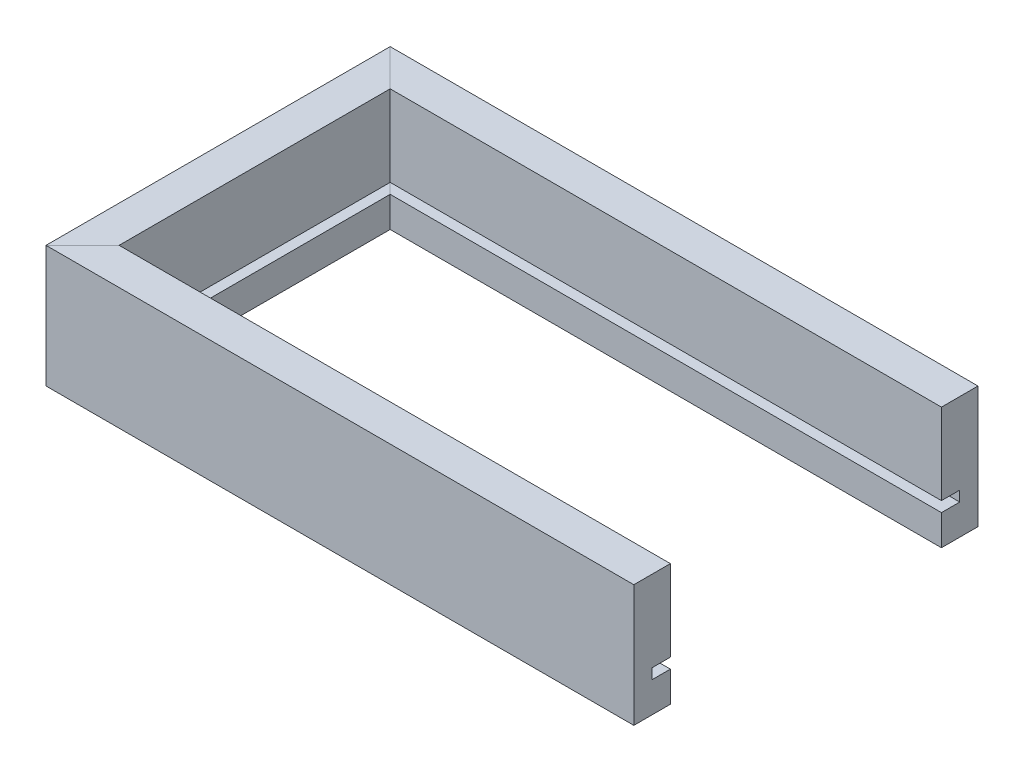
ISO-10303-21;
HEADER;
FILE_DESCRIPTION(('STEP AP214'),'2;1');
FILE_NAME('part.step','',(''),(''),'','','');
FILE_SCHEMA(('AUTOMOTIVE_DESIGN { 1 0 10303 214 1 1 1 1 }'));
ENDSEC;
DATA;
#1=APPLICATION_CONTEXT('core data for automotive mechanical design processes');
#2=APPLICATION_PROTOCOL_DEFINITION('international standard','automotive_design',2000,#1);
#3=PRODUCT_CONTEXT('',#1,'mechanical');
#4=PRODUCT('Part','Part','',(#3));
#5=PRODUCT_RELATED_PRODUCT_CATEGORY('part','',(#4));
#6=PRODUCT_DEFINITION_FORMATION('','',#4);
#7=PRODUCT_DEFINITION_CONTEXT('part definition',#1,'design');
#8=PRODUCT_DEFINITION('design','',#6,#7);
#9=PRODUCT_DEFINITION_SHAPE('','',#8);
#10=(LENGTH_UNIT() NAMED_UNIT(*) SI_UNIT(.MILLI.,.METRE.));
#11=(NAMED_UNIT(*) PLANE_ANGLE_UNIT() SI_UNIT($,.RADIAN.));
#12=(NAMED_UNIT(*) SI_UNIT($,.STERADIAN.) SOLID_ANGLE_UNIT());
#13=UNCERTAINTY_MEASURE_WITH_UNIT(LENGTH_MEASURE(1.E-05),#10,'distance_accuracy_value','');
#14=(GEOMETRIC_REPRESENTATION_CONTEXT(3) GLOBAL_UNCERTAINTY_ASSIGNED_CONTEXT((#13)) GLOBAL_UNIT_ASSIGNED_CONTEXT((#10,
#11,#12)) REPRESENTATION_CONTEXT('',''));
#15=CARTESIAN_POINT('',(0.,0.,0.));
#16=DIRECTION('',(0.,0.,1.));
#17=DIRECTION('',(1.,0.,0.));
#18=AXIS2_PLACEMENT_3D('',#15,#16,#17);
#19=CARTESIAN_POINT('',(46.75,0.,0.));
#20=DIRECTION('',(1.,0.,0.));
#21=DIRECTION('',(0.,0.,-1.));
#22=AXIS2_PLACEMENT_3D('',#19,#20,#21);
#23=PLANE('',#22);
#24=DIRECTION('',(0.,0.,-1.));
#25=VECTOR('',#24,1.);
#26=CARTESIAN_POINT('',(46.75,0.85,22.25));
#27=LINE('',#26,#25);
#28=CARTESIAN_POINT('',(46.75,0.85,25.25));
#29=VERTEX_POINT('',#28);
#30=CARTESIAN_POINT('',(46.75,0.85,22.25));
#31=VERTEX_POINT('',#30);
#32=EDGE_CURVE('E108',#29,#31,#27,.T.);
#33=ORIENTED_EDGE('',*,*,#32,.T.);
#34=DIRECTION('',(0.,1.,0.));
#35=VECTOR('',#34,1.);
#36=CARTESIAN_POINT('',(46.75,14.15,22.25));
#37=LINE('',#36,#35);
#38=CARTESIAN_POINT('',(46.75,14.15,22.25));
#39=VERTEX_POINT('',#38);
#40=EDGE_CURVE('E106',#31,#39,#37,.T.);
#41=ORIENTED_EDGE('',*,*,#40,.T.);
#42=DIRECTION('',(0.,0.,1.));
#43=VECTOR('',#42,1.);
#44=CARTESIAN_POINT('',(46.75,14.15,28.25));
#45=LINE('',#44,#43);
#46=CARTESIAN_POINT('',(46.75,14.15,28.25));
#47=VERTEX_POINT('',#46);
#48=EDGE_CURVE('E103',#39,#47,#45,.T.);
#49=ORIENTED_EDGE('',*,*,#48,.T.);
#50=DIRECTION('',(0.,-1.,0.));
#51=VECTOR('',#50,1.);
#52=CARTESIAN_POINT('',(46.75,-5.85,28.25));
#53=LINE('',#52,#51);
#54=CARTESIAN_POINT('',(46.75,-5.85,28.25));
#55=VERTEX_POINT('',#54);
#56=EDGE_CURVE('E122',#47,#55,#53,.T.);
#57=ORIENTED_EDGE('',*,*,#56,.T.);
#58=DIRECTION('',(0.,0.,-1.));
#59=VECTOR('',#58,1.);
#60=CARTESIAN_POINT('',(46.75,-5.85,22.25));
#61=LINE('',#60,#59);
#62=CARTESIAN_POINT('',(46.75,-5.85,22.25));
#63=VERTEX_POINT('',#62);
#64=EDGE_CURVE('E149',#55,#63,#61,.T.);
#65=ORIENTED_EDGE('',*,*,#64,.T.);
#66=DIRECTION('',(0.,1.,0.));
#67=VECTOR('',#66,1.);
#68=CARTESIAN_POINT('',(46.75,-0.85,22.25));
#69=LINE('',#68,#67);
#70=CARTESIAN_POINT('',(46.75,-0.85,22.25));
#71=VERTEX_POINT('',#70);
#72=EDGE_CURVE('E151',#63,#71,#69,.T.);
#73=ORIENTED_EDGE('',*,*,#72,.T.);
#74=DIRECTION('',(0.,0.,1.));
#75=VECTOR('',#74,1.);
#76=CARTESIAN_POINT('',(46.75,-0.85,22.25));
#77=LINE('',#76,#75);
#78=CARTESIAN_POINT('',(46.75,-0.85,25.25));
#79=VERTEX_POINT('',#78);
#80=EDGE_CURVE('E153',#71,#79,#77,.T.);
#81=ORIENTED_EDGE('',*,*,#80,.T.);
#82=DIRECTION('',(0.,1.,0.));
#83=VECTOR('',#82,1.);
#84=CARTESIAN_POINT('',(46.75,0.85,25.25));
#85=LINE('',#84,#83);
#86=EDGE_CURVE('E155',#79,#29,#85,.T.);
#87=ORIENTED_EDGE('',*,*,#86,.T.);
#88=EDGE_LOOP('',(#33,#41,#49,#57,#65,#73,#81,#87));
#89=FACE_BOUND('',#88,.T.);
#90=ADVANCED_FACE('F33',(#89),#23,.T.);
#91=CARTESIAN_POINT('',(46.75,0.,0.));
#92=DIRECTION('',(-1.,0.,0.));
#93=DIRECTION('',(0.,0.,1.));
#94=AXIS2_PLACEMENT_3D('',#91,#92,#93);
#95=PLANE('',#94);
#96=DIRECTION('',(0.,0.,1.));
#97=VECTOR('',#96,1.);
#98=CARTESIAN_POINT('',(46.75,0.85,-22.25));
#99=LINE('',#98,#97);
#100=CARTESIAN_POINT('',(46.75,0.85,-25.25));
#101=VERTEX_POINT('',#100);
#102=CARTESIAN_POINT('',(46.75,0.85,-22.25));
#103=VERTEX_POINT('',#102);
#104=EDGE_CURVE('E208',#101,#103,#99,.T.);
#105=ORIENTED_EDGE('',*,*,#104,.F.);
#106=DIRECTION('',(0.,1.,0.));
#107=VECTOR('',#106,1.);
#108=CARTESIAN_POINT('',(46.75,0.85,-25.25));
#109=LINE('',#108,#107);
#110=CARTESIAN_POINT('',(46.75,-0.85,-25.25));
#111=VERTEX_POINT('',#110);
#112=EDGE_CURVE('E214',#111,#101,#109,.T.);
#113=ORIENTED_EDGE('',*,*,#112,.F.);
#114=DIRECTION('',(0.,0.,-1.));
#115=VECTOR('',#114,1.);
#116=CARTESIAN_POINT('',(46.75,-0.85,-22.25));
#117=LINE('',#116,#115);
#118=CARTESIAN_POINT('',(46.75,-0.85,-22.25));
#119=VERTEX_POINT('',#118);
#120=EDGE_CURVE('E220',#119,#111,#117,.T.);
#121=ORIENTED_EDGE('',*,*,#120,.F.);
#122=DIRECTION('',(0.,1.,0.));
#123=VECTOR('',#122,1.);
#124=CARTESIAN_POINT('',(46.75,-0.85,-22.25));
#125=LINE('',#124,#123);
#126=CARTESIAN_POINT('',(46.75,-5.85,-22.25));
#127=VERTEX_POINT('',#126);
#128=EDGE_CURVE('E226',#127,#119,#125,.T.);
#129=ORIENTED_EDGE('',*,*,#128,.F.);
#130=DIRECTION('',(0.,0.,1.));
#131=VECTOR('',#130,1.);
#132=CARTESIAN_POINT('',(46.75,-5.85,-22.25));
#133=LINE('',#132,#131);
#134=CARTESIAN_POINT('',(46.75,-5.85,-28.25));
#135=VERTEX_POINT('',#134);
#136=EDGE_CURVE('E232',#135,#127,#133,.T.);
#137=ORIENTED_EDGE('',*,*,#136,.F.);
#138=DIRECTION('',(0.,-1.,0.));
#139=VECTOR('',#138,1.);
#140=CARTESIAN_POINT('',(46.75,-5.85,-28.25));
#141=LINE('',#140,#139);
#142=CARTESIAN_POINT('',(46.75,14.15,-28.25));
#143=VERTEX_POINT('',#142);
#144=EDGE_CURVE('E238',#143,#135,#141,.T.);
#145=ORIENTED_EDGE('',*,*,#144,.F.);
#146=DIRECTION('',(0.,0.,-1.));
#147=VECTOR('',#146,1.);
#148=CARTESIAN_POINT('',(46.75,14.15,-28.25));
#149=LINE('',#148,#147);
#150=CARTESIAN_POINT('',(46.75,14.15,-22.25));
#151=VERTEX_POINT('',#150);
#152=EDGE_CURVE('E198',#151,#143,#149,.T.);
#153=ORIENTED_EDGE('',*,*,#152,.F.);
#154=DIRECTION('',(0.,1.,0.));
#155=VECTOR('',#154,1.);
#156=CARTESIAN_POINT('',(46.75,14.15,-22.25));
#157=LINE('',#156,#155);
#158=EDGE_CURVE('E204',#103,#151,#157,.T.);
#159=ORIENTED_EDGE('',*,*,#158,.F.);
#160=EDGE_LOOP('',(#105,#113,#121,#129,#137,#145,#153,#159));
#161=FACE_BOUND('',#160,.T.);
#162=ADVANCED_FACE('F284',(#161),#95,.F.);
#163=CARTESIAN_POINT('',(-50.15,14.15,28.25));
#164=DIRECTION('',(0.,1.,0.));
#165=DIRECTION('',(0.,0.,1.));
#166=AXIS2_PLACEMENT_3D('',#163,#164,#165);
#167=PLANE('',#166);
#168=DIRECTION('',(0.707106781186548,0.,-0.707106781186548));
#169=VECTOR('',#168,1.);
#170=CARTESIAN_POINT('',(-21.3,14.15,-0.200000000000002));
#171=LINE('',#170,#169);
#172=CARTESIAN_POINT('',(-49.75,14.15,28.25));
#173=VERTEX_POINT('',#172);
#174=CARTESIAN_POINT('',(-43.75,14.15,22.25));
#175=VERTEX_POINT('',#174);
#176=EDGE_CURVE('E158',#173,#175,#171,.T.);
#177=ORIENTED_EDGE('',*,*,#176,.F.);
#178=DIRECTION('',(1.,0.,0.));
#179=VECTOR('',#178,1.);
#180=CARTESIAN_POINT('',(-50.15,14.15,28.25));
#181=LINE('',#180,#179);
#182=EDGE_CURVE('E120',#173,#47,#181,.T.);
#183=ORIENTED_EDGE('',*,*,#182,.T.);
#184=ORIENTED_EDGE('',*,*,#48,.F.);
#185=DIRECTION('',(1.,0.,0.));
#186=VECTOR('',#185,1.);
#187=CARTESIAN_POINT('',(-50.15,14.15,22.25));
#188=LINE('',#187,#186);
#189=EDGE_CURVE('E36',#175,#39,#188,.T.);
#190=ORIENTED_EDGE('',*,*,#189,.F.);
#191=EDGE_LOOP('',(#177,#183,#184,#190));
#192=FACE_BOUND('',#191,.T.);
#193=ADVANCED_FACE('F117',(#192),#167,.T.);
#194=CARTESIAN_POINT('',(-50.15,-5.85,28.25));
#195=DIRECTION('',(0.,0.,1.));
#196=DIRECTION('',(1.,0.,0.));
#197=AXIS2_PLACEMENT_3D('',#194,#195,#196);
#198=PLANE('',#197);
#199=DIRECTION('',(0.,1.,0.));
#200=VECTOR('',#199,1.);
#201=CARTESIAN_POINT('',(-49.75,-5.85,28.25));
#202=LINE('',#201,#200);
#203=CARTESIAN_POINT('',(-49.75,-5.85,28.25));
#204=VERTEX_POINT('',#203);
#205=EDGE_CURVE('E195',#204,#173,#202,.T.);
#206=ORIENTED_EDGE('',*,*,#205,.F.);
#207=DIRECTION('',(1.,0.,0.));
#208=VECTOR('',#207,1.);
#209=CARTESIAN_POINT('',(-50.15,-5.85,28.25));
#210=LINE('',#209,#208);
#211=EDGE_CURVE('E131',#204,#55,#210,.T.);
#212=ORIENTED_EDGE('',*,*,#211,.T.);
#213=ORIENTED_EDGE('',*,*,#56,.F.);
#214=ORIENTED_EDGE('',*,*,#182,.F.);
#215=EDGE_LOOP('',(#206,#212,#213,#214));
#216=FACE_BOUND('',#215,.T.);
#217=ADVANCED_FACE('F353',(#216),#198,.T.);
#218=CARTESIAN_POINT('',(-50.15,-5.85,22.25));
#219=DIRECTION('',(0.,-1.,0.));
#220=DIRECTION('',(0.,0.,-1.));
#221=AXIS2_PLACEMENT_3D('',#218,#219,#220);
#222=PLANE('',#221);
#223=DIRECTION('',(-0.707106781186548,0.,0.707106781186548));
#224=VECTOR('',#223,1.);
#225=CARTESIAN_POINT('',(-18.3,-5.85,-3.20000000000001));
#226=LINE('',#225,#224);
#227=CARTESIAN_POINT('',(-43.75,-5.85,22.25));
#228=VERTEX_POINT('',#227);
#229=EDGE_CURVE('E192',#228,#204,#226,.T.);
#230=ORIENTED_EDGE('',*,*,#229,.F.);
#231=DIRECTION('',(1.,0.,0.));
#232=VECTOR('',#231,1.);
#233=CARTESIAN_POINT('',(-50.15,-5.85,22.25));
#234=LINE('',#233,#232);
#235=EDGE_CURVE('E133',#228,#63,#234,.T.);
#236=ORIENTED_EDGE('',*,*,#235,.T.);
#237=ORIENTED_EDGE('',*,*,#64,.F.);
#238=ORIENTED_EDGE('',*,*,#211,.F.);
#239=EDGE_LOOP('',(#230,#236,#237,#238));
#240=FACE_BOUND('',#239,.T.);
#241=ADVANCED_FACE('F359',(#240),#222,.T.);
#242=CARTESIAN_POINT('',(-50.15,-0.85,22.25));
#243=DIRECTION('',(0.,0.,-1.));
#244=DIRECTION('',(0.,1.,0.));
#245=AXIS2_PLACEMENT_3D('',#242,#243,#244);
#246=PLANE('',#245);
#247=DIRECTION('',(0.,-1.,0.));
#248=VECTOR('',#247,1.);
#249=CARTESIAN_POINT('',(-43.75,-0.850000000000035,22.25));
#250=LINE('',#249,#248);
#251=CARTESIAN_POINT('',(-43.75,-0.85,22.25));
#252=VERTEX_POINT('',#251);
#253=EDGE_CURVE('E189',#252,#228,#250,.T.);
#254=ORIENTED_EDGE('',*,*,#253,.F.);
#255=DIRECTION('',(1.,0.,0.));
#256=VECTOR('',#255,1.);
#257=CARTESIAN_POINT('',(-50.15,-0.85,22.25));
#258=LINE('',#257,#256);
#259=EDGE_CURVE('E138',#252,#71,#258,.T.);
#260=ORIENTED_EDGE('',*,*,#259,.T.);
#261=ORIENTED_EDGE('',*,*,#72,.F.);
#262=ORIENTED_EDGE('',*,*,#235,.F.);
#263=EDGE_LOOP('',(#254,#260,#261,#262));
#264=FACE_BOUND('',#263,.T.);
#265=ADVANCED_FACE('F363',(#264),#246,.T.);
#266=CARTESIAN_POINT('',(-50.15,-0.85,22.25));
#267=DIRECTION('',(0.,1.,0.));
#268=DIRECTION('',(0.,0.,1.));
#269=AXIS2_PLACEMENT_3D('',#266,#267,#268);
#270=PLANE('',#269);
#271=DIRECTION('',(0.707106781186548,0.,-0.707106781186548));
#272=VECTOR('',#271,1.);
#273=CARTESIAN_POINT('',(-18.3,-0.849999999999999,-3.2));
#274=LINE('',#273,#272);
#275=CARTESIAN_POINT('',(-46.75,-0.85,25.25));
#276=VERTEX_POINT('',#275);
#277=EDGE_CURVE('E186',#276,#252,#274,.T.);
#278=ORIENTED_EDGE('',*,*,#277,.F.);
#279=DIRECTION('',(1.,0.,0.));
#280=VECTOR('',#279,1.);
#281=CARTESIAN_POINT('',(-50.15,-0.85,25.25));
#282=LINE('',#281,#280);
#283=EDGE_CURVE('E141',#276,#79,#282,.T.);
#284=ORIENTED_EDGE('',*,*,#283,.T.);
#285=ORIENTED_EDGE('',*,*,#80,.F.);
#286=ORIENTED_EDGE('',*,*,#259,.F.);
#287=EDGE_LOOP('',(#278,#284,#285,#286));
#288=FACE_BOUND('',#287,.T.);
#289=ADVANCED_FACE('F368',(#288),#270,.T.);
#290=CARTESIAN_POINT('',(-50.15,0.85,25.25));
#291=DIRECTION('',(0.,0.,-1.));
#292=DIRECTION('',(-1.,0.,0.));
#293=AXIS2_PLACEMENT_3D('',#290,#291,#292);
#294=PLANE('',#293);
#295=DIRECTION('',(0.,-1.,0.));
#296=VECTOR('',#295,1.);
#297=CARTESIAN_POINT('',(-46.75,0.85,25.25));
#298=LINE('',#297,#296);
#299=CARTESIAN_POINT('',(-46.75,0.85,25.25));
#300=VERTEX_POINT('',#299);
#301=EDGE_CURVE('E183',#300,#276,#298,.T.);
#302=ORIENTED_EDGE('',*,*,#301,.F.);
#303=DIRECTION('',(1.,0.,0.));
#304=VECTOR('',#303,1.);
#305=CARTESIAN_POINT('',(-50.15,0.85,25.25));
#306=LINE('',#305,#304);
#307=EDGE_CURVE('E144',#300,#29,#306,.T.);
#308=ORIENTED_EDGE('',*,*,#307,.T.);
#309=ORIENTED_EDGE('',*,*,#86,.F.);
#310=ORIENTED_EDGE('',*,*,#283,.F.);
#311=EDGE_LOOP('',(#302,#308,#309,#310));
#312=FACE_BOUND('',#311,.T.);
#313=ADVANCED_FACE('F371',(#312),#294,.T.);
#314=CARTESIAN_POINT('',(-50.15,0.85,22.25));
#315=DIRECTION('',(0.,-1.,0.));
#316=DIRECTION('',(0.,0.,-1.));
#317=AXIS2_PLACEMENT_3D('',#314,#315,#316);
#318=PLANE('',#317);
#319=DIRECTION('',(-0.707106781186548,0.,0.707106781186548));
#320=VECTOR('',#319,1.);
#321=CARTESIAN_POINT('',(-18.3,0.849999999999999,-3.2));
#322=LINE('',#321,#320);
#323=CARTESIAN_POINT('',(-43.75,0.85,22.25));
#324=VERTEX_POINT('',#323);
#325=EDGE_CURVE('E180',#324,#300,#322,.T.);
#326=ORIENTED_EDGE('',*,*,#325,.F.);
#327=DIRECTION('',(1.,0.,0.));
#328=VECTOR('',#327,1.);
#329=CARTESIAN_POINT('',(-50.15,0.85,22.25));
#330=LINE('',#329,#328);
#331=EDGE_CURVE('E121',#324,#31,#330,.T.);
#332=ORIENTED_EDGE('',*,*,#331,.T.);
#333=ORIENTED_EDGE('',*,*,#32,.F.);
#334=ORIENTED_EDGE('',*,*,#307,.F.);
#335=EDGE_LOOP('',(#326,#332,#333,#334));
#336=FACE_BOUND('',#335,.T.);
#337=ADVANCED_FACE('F348',(#336),#318,.T.);
#338=CARTESIAN_POINT('',(-50.15,14.15,22.25));
#339=DIRECTION('',(0.,0.,-1.));
#340=DIRECTION('',(0.,1.,0.));
#341=AXIS2_PLACEMENT_3D('',#338,#339,#340);
#342=PLANE('',#341);
#343=DIRECTION('',(0.,-1.,0.));
#344=VECTOR('',#343,1.);
#345=CARTESIAN_POINT('',(-43.75,14.15,22.25));
#346=LINE('',#345,#344);
#347=EDGE_CURVE('E126',#175,#324,#346,.T.);
#348=ORIENTED_EDGE('',*,*,#347,.F.);
#349=ORIENTED_EDGE('',*,*,#189,.T.);
#350=ORIENTED_EDGE('',*,*,#40,.F.);
#351=ORIENTED_EDGE('',*,*,#331,.F.);
#352=EDGE_LOOP('',(#348,#349,#350,#351));
#353=FACE_BOUND('',#352,.T.);
#354=ADVANCED_FACE('F124',(#353),#342,.T.);
#355=CARTESIAN_POINT('',(-43.75,14.15,-28.65));
#356=DIRECTION('',(1.,0.,0.));
#357=DIRECTION('',(0.,1.,0.));
#358=AXIS2_PLACEMENT_3D('',#355,#356,#357);
#359=PLANE('',#358);
#360=DIRECTION('',(0.,0.,1.));
#361=VECTOR('',#360,1.);
#362=CARTESIAN_POINT('',(-43.75,14.15,-28.65));
#363=LINE('',#362,#361);
#364=CARTESIAN_POINT('',(-43.75,14.15,-22.25));
#365=VERTEX_POINT('',#364);
#366=EDGE_CURVE('E160',#365,#175,#363,.T.);
#367=ORIENTED_EDGE('',*,*,#366,.T.);
#368=ORIENTED_EDGE('',*,*,#347,.T.);
#369=DIRECTION('',(0.,0.,1.));
#370=VECTOR('',#369,1.);
#371=CARTESIAN_POINT('',(-43.75,0.85,-28.65));
#372=LINE('',#371,#370);
#373=CARTESIAN_POINT('',(-43.75,0.85,-22.25));
#374=VERTEX_POINT('',#373);
#375=EDGE_CURVE('E127',#374,#324,#372,.T.);
#376=ORIENTED_EDGE('',*,*,#375,.F.);
#377=DIRECTION('',(0.,-1.,0.));
#378=VECTOR('',#377,1.);
#379=CARTESIAN_POINT('',(-43.75,14.15,-22.25));
#380=LINE('',#379,#378);
#381=EDGE_CURVE('E202',#365,#374,#380,.T.);
#382=ORIENTED_EDGE('',*,*,#381,.F.);
#383=EDGE_LOOP('',(#367,#368,#376,#382));
#384=FACE_BOUND('',#383,.T.);
#385=ADVANCED_FACE('F349',(#384),#359,.T.);
#386=CARTESIAN_POINT('',(-43.75,0.85,-28.65));
#387=DIRECTION('',(0.,-1.,0.));
#388=DIRECTION('',(1.,0.,0.));
#389=AXIS2_PLACEMENT_3D('',#386,#387,#388);
#390=PLANE('',#389);
#391=ORIENTED_EDGE('',*,*,#375,.T.);
#392=ORIENTED_EDGE('',*,*,#325,.T.);
#393=DIRECTION('',(0.,0.,1.));
#394=VECTOR('',#393,1.);
#395=CARTESIAN_POINT('',(-46.75,0.85,-28.65));
#396=LINE('',#395,#394);
#397=CARTESIAN_POINT('',(-46.75,0.85,-25.25));
#398=VERTEX_POINT('',#397);
#399=EDGE_CURVE('E129',#398,#300,#396,.T.);
#400=ORIENTED_EDGE('',*,*,#399,.F.);
#401=DIRECTION('',(-0.707106781186548,0.,-0.707106781186548));
#402=VECTOR('',#401,1.);
#403=CARTESIAN_POINT('',(1.5,0.849999999999998,23.));
#404=LINE('',#403,#402);
#405=EDGE_CURVE('E252',#374,#398,#404,.T.);
#406=ORIENTED_EDGE('',*,*,#405,.F.);
#407=EDGE_LOOP('',(#391,#392,#400,#406));
#408=FACE_BOUND('',#407,.T.);
#409=ADVANCED_FACE('F345',(#408),#390,.T.);
#410=CARTESIAN_POINT('',(-46.75,0.85,-28.65));
#411=DIRECTION('',(1.,0.,0.));
#412=DIRECTION('',(0.,0.,-1.));
#413=AXIS2_PLACEMENT_3D('',#410,#411,#412);
#414=PLANE('',#413);
#415=ORIENTED_EDGE('',*,*,#399,.T.);
#416=ORIENTED_EDGE('',*,*,#301,.T.);
#417=DIRECTION('',(0.,0.,1.));
#418=VECTOR('',#417,1.);
#419=CARTESIAN_POINT('',(-46.75,-0.85,-28.65));
#420=LINE('',#419,#418);
#421=CARTESIAN_POINT('',(-46.75,-0.85,-25.25));
#422=VERTEX_POINT('',#421);
#423=EDGE_CURVE('E174',#422,#276,#420,.T.);
#424=ORIENTED_EDGE('',*,*,#423,.F.);
#425=DIRECTION('',(0.,-1.,0.));
#426=VECTOR('',#425,1.);
#427=CARTESIAN_POINT('',(-46.75,0.85,-25.25));
#428=LINE('',#427,#426);
#429=EDGE_CURVE('E255',#398,#422,#428,.T.);
#430=ORIENTED_EDGE('',*,*,#429,.F.);
#431=EDGE_LOOP('',(#415,#416,#424,#430));
#432=FACE_BOUND('',#431,.T.);
#433=ADVANCED_FACE('F343',(#432),#414,.T.);
#434=CARTESIAN_POINT('',(-43.75,-0.85,-28.65));
#435=DIRECTION('',(0.,1.,0.));
#436=DIRECTION('',(-1.,0.,0.));
#437=AXIS2_PLACEMENT_3D('',#434,#435,#436);
#438=PLANE('',#437);
#439=ORIENTED_EDGE('',*,*,#423,.T.);
#440=ORIENTED_EDGE('',*,*,#277,.T.);
#441=DIRECTION('',(0.,0.,1.));
#442=VECTOR('',#441,1.);
#443=CARTESIAN_POINT('',(-43.75,-0.85,-28.65));
#444=LINE('',#443,#442);
#445=CARTESIAN_POINT('',(-43.75,-0.85,-22.25));
#446=VERTEX_POINT('',#445);
#447=EDGE_CURVE('E171',#446,#252,#444,.T.);
#448=ORIENTED_EDGE('',*,*,#447,.F.);
#449=DIRECTION('',(0.707106781186548,0.,0.707106781186548));
#450=VECTOR('',#449,1.);
#451=CARTESIAN_POINT('',(1.5,-0.849999999999998,23.));
#452=LINE('',#451,#450);
#453=EDGE_CURVE('E258',#422,#446,#452,.T.);
#454=ORIENTED_EDGE('',*,*,#453,.F.);
#455=EDGE_LOOP('',(#439,#440,#448,#454));
#456=FACE_BOUND('',#455,.T.);
#457=ADVANCED_FACE('F320',(#456),#438,.T.);
#458=CARTESIAN_POINT('',(-43.75,-0.85,-28.65));
#459=DIRECTION('',(1.,0.,0.));
#460=DIRECTION('',(0.,1.,0.));
#461=AXIS2_PLACEMENT_3D('',#458,#459,#460);
#462=PLANE('',#461);
#463=ORIENTED_EDGE('',*,*,#447,.T.);
#464=ORIENTED_EDGE('',*,*,#253,.T.);
#465=DIRECTION('',(0.,0.,1.));
#466=VECTOR('',#465,1.);
#467=CARTESIAN_POINT('',(-43.75,-5.85,-28.65));
#468=LINE('',#467,#466);
#469=CARTESIAN_POINT('',(-43.75,-5.85,-22.25));
#470=VERTEX_POINT('',#469);
#471=EDGE_CURVE('E168',#470,#228,#468,.T.);
#472=ORIENTED_EDGE('',*,*,#471,.F.);
#473=DIRECTION('',(0.,-1.,0.));
#474=VECTOR('',#473,1.);
#475=CARTESIAN_POINT('',(-43.75,-0.850000000000063,-22.25));
#476=LINE('',#475,#474);
#477=EDGE_CURVE('E261',#446,#470,#476,.T.);
#478=ORIENTED_EDGE('',*,*,#477,.F.);
#479=EDGE_LOOP('',(#463,#464,#472,#478));
#480=FACE_BOUND('',#479,.T.);
#481=ADVANCED_FACE('F317',(#480),#462,.T.);
#482=CARTESIAN_POINT('',(-43.75,-5.85,-28.65));
#483=DIRECTION('',(0.,-1.,0.));
#484=DIRECTION('',(1.,0.,0.));
#485=AXIS2_PLACEMENT_3D('',#482,#483,#484);
#486=PLANE('',#485);
#487=ORIENTED_EDGE('',*,*,#471,.T.);
#488=ORIENTED_EDGE('',*,*,#229,.T.);
#489=DIRECTION('',(0.,0.,1.));
#490=VECTOR('',#489,1.);
#491=CARTESIAN_POINT('',(-49.75,-5.85,-28.65));
#492=LINE('',#491,#490);
#493=CARTESIAN_POINT('',(-49.75,-5.85,-28.25));
#494=VERTEX_POINT('',#493);
#495=EDGE_CURVE('E166',#494,#204,#492,.T.);
#496=ORIENTED_EDGE('',*,*,#495,.F.);
#497=DIRECTION('',(-0.707106781186548,0.,-0.707106781186548));
#498=VECTOR('',#497,1.);
#499=CARTESIAN_POINT('',(1.5,-5.84999999999999,23.));
#500=LINE('',#499,#498);
#501=EDGE_CURVE('E42',#470,#494,#500,.T.);
#502=ORIENTED_EDGE('',*,*,#501,.F.);
#503=EDGE_LOOP('',(#487,#488,#496,#502));
#504=FACE_BOUND('',#503,.T.);
#505=ADVANCED_FACE('F356',(#504),#486,.T.);
#506=CARTESIAN_POINT('',(-49.75,-5.85,-28.65));
#507=DIRECTION('',(-1.,0.,0.));
#508=DIRECTION('',(0.,0.,1.));
#509=AXIS2_PLACEMENT_3D('',#506,#507,#508);
#510=PLANE('',#509);
#511=ORIENTED_EDGE('',*,*,#495,.T.);
#512=ORIENTED_EDGE('',*,*,#205,.T.);
#513=DIRECTION('',(0.,0.,1.));
#514=VECTOR('',#513,1.);
#515=CARTESIAN_POINT('',(-49.75,14.15,-28.65));
#516=LINE('',#515,#514);
#517=CARTESIAN_POINT('',(-49.75,14.15,-28.25));
#518=VERTEX_POINT('',#517);
#519=EDGE_CURVE('E163',#518,#173,#516,.T.);
#520=ORIENTED_EDGE('',*,*,#519,.F.);
#521=DIRECTION('',(0.,1.,0.));
#522=VECTOR('',#521,1.);
#523=CARTESIAN_POINT('',(-49.75,-5.85,-28.25));
#524=LINE('',#523,#522);
#525=EDGE_CURVE('E11',#494,#518,#524,.T.);
#526=ORIENTED_EDGE('',*,*,#525,.F.);
#527=EDGE_LOOP('',(#511,#512,#520,#526));
#528=FACE_BOUND('',#527,.T.);
#529=ADVANCED_FACE('F355',(#528),#510,.T.);
#530=CARTESIAN_POINT('',(-49.75,14.15,-28.65));
#531=DIRECTION('',(0.,1.,0.));
#532=DIRECTION('',(0.,0.,1.));
#533=AXIS2_PLACEMENT_3D('',#530,#531,#532);
#534=PLANE('',#533);
#535=ORIENTED_EDGE('',*,*,#519,.T.);
#536=ORIENTED_EDGE('',*,*,#176,.T.);
#537=ORIENTED_EDGE('',*,*,#366,.F.);
#538=DIRECTION('',(0.707106781186548,0.,0.707106781186548));
#539=VECTOR('',#538,1.);
#540=CARTESIAN_POINT('',(-1.49999999999999,14.15,20.));
#541=LINE('',#540,#539);
#542=EDGE_CURVE('E199',#518,#365,#541,.T.);
#543=ORIENTED_EDGE('',*,*,#542,.F.);
#544=EDGE_LOOP('',(#535,#536,#537,#543));
#545=FACE_BOUND('',#544,.T.);
#546=ADVANCED_FACE('F351',(#545),#534,.T.);
#547=CARTESIAN_POINT('',(46.75,14.15,-22.25));
#548=DIRECTION('',(0.,0.,1.));
#549=DIRECTION('',(0.,-1.,0.));
#550=AXIS2_PLACEMENT_3D('',#547,#548,#549);
#551=PLANE('',#550);
#552=DIRECTION('',(-1.,0.,0.));
#553=VECTOR('',#552,1.);
#554=CARTESIAN_POINT('',(46.75,14.15,-22.25));
#555=LINE('',#554,#553);
#556=EDGE_CURVE('E207',#151,#365,#555,.T.);
#557=ORIENTED_EDGE('',*,*,#556,.T.);
#558=ORIENTED_EDGE('',*,*,#381,.T.);
#559=DIRECTION('',(-1.,0.,0.));
#560=VECTOR('',#559,1.);
#561=CARTESIAN_POINT('',(46.75,0.85,-22.25));
#562=LINE('',#561,#560);
#563=EDGE_CURVE('E203',#103,#374,#562,.T.);
#564=ORIENTED_EDGE('',*,*,#563,.F.);
#565=ORIENTED_EDGE('',*,*,#158,.T.);
#566=EDGE_LOOP('',(#557,#558,#564,#565));
#567=FACE_BOUND('',#566,.T.);
#568=ADVANCED_FACE('F295',(#567),#551,.T.);
#569=CARTESIAN_POINT('',(46.75,0.85,-22.25));
#570=DIRECTION('',(0.,-1.,0.));
#571=DIRECTION('',(0.,0.,-1.));
#572=AXIS2_PLACEMENT_3D('',#569,#570,#571);
#573=PLANE('',#572);
#574=ORIENTED_EDGE('',*,*,#563,.T.);
#575=ORIENTED_EDGE('',*,*,#405,.T.);
#576=DIRECTION('',(-1.,0.,0.));
#577=VECTOR('',#576,1.);
#578=CARTESIAN_POINT('',(46.75,0.85,-25.25));
#579=LINE('',#578,#577);
#580=EDGE_CURVE('E211',#101,#398,#579,.T.);
#581=ORIENTED_EDGE('',*,*,#580,.F.);
#582=ORIENTED_EDGE('',*,*,#104,.T.);
#583=EDGE_LOOP('',(#574,#575,#581,#582));
#584=FACE_BOUND('',#583,.T.);
#585=ADVANCED_FACE('F338',(#584),#573,.T.);
#586=CARTESIAN_POINT('',(46.75,0.85,-25.25));
#587=DIRECTION('',(0.,0.,1.));
#588=DIRECTION('',(1.,0.,0.));
#589=AXIS2_PLACEMENT_3D('',#586,#587,#588);
#590=PLANE('',#589);
#591=ORIENTED_EDGE('',*,*,#580,.T.);
#592=ORIENTED_EDGE('',*,*,#429,.T.);
#593=DIRECTION('',(-1.,0.,0.));
#594=VECTOR('',#593,1.);
#595=CARTESIAN_POINT('',(46.75,-0.85,-25.25));
#596=LINE('',#595,#594);
#597=EDGE_CURVE('E217',#111,#422,#596,.T.);
#598=ORIENTED_EDGE('',*,*,#597,.F.);
#599=ORIENTED_EDGE('',*,*,#112,.T.);
#600=EDGE_LOOP('',(#591,#592,#598,#599));
#601=FACE_BOUND('',#600,.T.);
#602=ADVANCED_FACE('F340',(#601),#590,.T.);
#603=CARTESIAN_POINT('',(46.75,-0.85,-22.25));
#604=DIRECTION('',(0.,1.,0.));
#605=DIRECTION('',(0.,0.,1.));
#606=AXIS2_PLACEMENT_3D('',#603,#604,#605);
#607=PLANE('',#606);
#608=ORIENTED_EDGE('',*,*,#597,.T.);
#609=ORIENTED_EDGE('',*,*,#453,.T.);
#610=DIRECTION('',(-1.,0.,0.));
#611=VECTOR('',#610,1.);
#612=CARTESIAN_POINT('',(46.75,-0.85,-22.25));
#613=LINE('',#612,#611);
#614=EDGE_CURVE('E223',#119,#446,#613,.T.);
#615=ORIENTED_EDGE('',*,*,#614,.F.);
#616=ORIENTED_EDGE('',*,*,#120,.T.);
#617=EDGE_LOOP('',(#608,#609,#615,#616));
#618=FACE_BOUND('',#617,.T.);
#619=ADVANCED_FACE('F324',(#618),#607,.T.);
#620=CARTESIAN_POINT('',(46.75,-0.85,-22.25));
#621=DIRECTION('',(0.,0.,1.));
#622=DIRECTION('',(0.,-1.,0.));
#623=AXIS2_PLACEMENT_3D('',#620,#621,#622);
#624=PLANE('',#623);
#625=ORIENTED_EDGE('',*,*,#614,.T.);
#626=ORIENTED_EDGE('',*,*,#477,.T.);
#627=DIRECTION('',(-1.,0.,0.));
#628=VECTOR('',#627,1.);
#629=CARTESIAN_POINT('',(46.75,-5.85,-22.25));
#630=LINE('',#629,#628);
#631=EDGE_CURVE('E229',#127,#470,#630,.T.);
#632=ORIENTED_EDGE('',*,*,#631,.F.);
#633=ORIENTED_EDGE('',*,*,#128,.T.);
#634=EDGE_LOOP('',(#625,#626,#632,#633));
#635=FACE_BOUND('',#634,.T.);
#636=ADVANCED_FACE('F327',(#635),#624,.T.);
#637=CARTESIAN_POINT('',(46.75,-5.85,-22.25));
#638=DIRECTION('',(0.,-1.,0.));
#639=DIRECTION('',(0.,0.,-1.));
#640=AXIS2_PLACEMENT_3D('',#637,#638,#639);
#641=PLANE('',#640);
#642=ORIENTED_EDGE('',*,*,#631,.T.);
#643=ORIENTED_EDGE('',*,*,#501,.T.);
#644=DIRECTION('',(-1.,0.,0.));
#645=VECTOR('',#644,1.);
#646=CARTESIAN_POINT('',(46.75,-5.85,-28.25));
#647=LINE('',#646,#645);
#648=EDGE_CURVE('E235',#135,#494,#647,.T.);
#649=ORIENTED_EDGE('',*,*,#648,.F.);
#650=ORIENTED_EDGE('',*,*,#136,.T.);
#651=EDGE_LOOP('',(#642,#643,#649,#650));
#652=FACE_BOUND('',#651,.T.);
#653=ADVANCED_FACE('F267',(#652),#641,.T.);
#654=CARTESIAN_POINT('',(46.75,-5.85,-28.25));
#655=DIRECTION('',(0.,0.,-1.));
#656=DIRECTION('',(-1.,0.,0.));
#657=AXIS2_PLACEMENT_3D('',#654,#655,#656);
#658=PLANE('',#657);
#659=ORIENTED_EDGE('',*,*,#648,.T.);
#660=ORIENTED_EDGE('',*,*,#525,.T.);
#661=DIRECTION('',(-1.,0.,0.));
#662=VECTOR('',#661,1.);
#663=CARTESIAN_POINT('',(46.75,14.15,-28.25));
#664=LINE('',#663,#662);
#665=EDGE_CURVE('E241',#143,#518,#664,.T.);
#666=ORIENTED_EDGE('',*,*,#665,.F.);
#667=ORIENTED_EDGE('',*,*,#144,.T.);
#668=EDGE_LOOP('',(#659,#660,#666,#667));
#669=FACE_BOUND('',#668,.T.);
#670=ADVANCED_FACE('F273',(#669),#658,.T.);
#671=CARTESIAN_POINT('',(46.75,14.15,-28.25));
#672=DIRECTION('',(0.,1.,0.));
#673=DIRECTION('',(0.,0.,1.));
#674=AXIS2_PLACEMENT_3D('',#671,#672,#673);
#675=PLANE('',#674);
#676=ORIENTED_EDGE('',*,*,#665,.T.);
#677=ORIENTED_EDGE('',*,*,#542,.T.);
#678=ORIENTED_EDGE('',*,*,#556,.F.);
#679=ORIENTED_EDGE('',*,*,#152,.T.);
#680=EDGE_LOOP('',(#676,#677,#678,#679));
#681=FACE_BOUND('',#680,.T.);
#682=ADVANCED_FACE('F290',(#681),#675,.T.);
#683=CLOSED_SHELL('',(#90,#162,#193,#217,#241,#265,#289,#313,#337,#354,#385,#409,#433,#457,#481,
#505,#529,#546,#568,#585,#602,#619,#636,#653,#670,#682));
#684=MANIFOLD_SOLID_BREP('B2',#683);
#685=ADVANCED_BREP_SHAPE_REPRESENTATION('',(#18,#684),#14);
#686=SHAPE_DEFINITION_REPRESENTATION(#9,#685);
ENDSEC;
END-ISO-10303-21;
